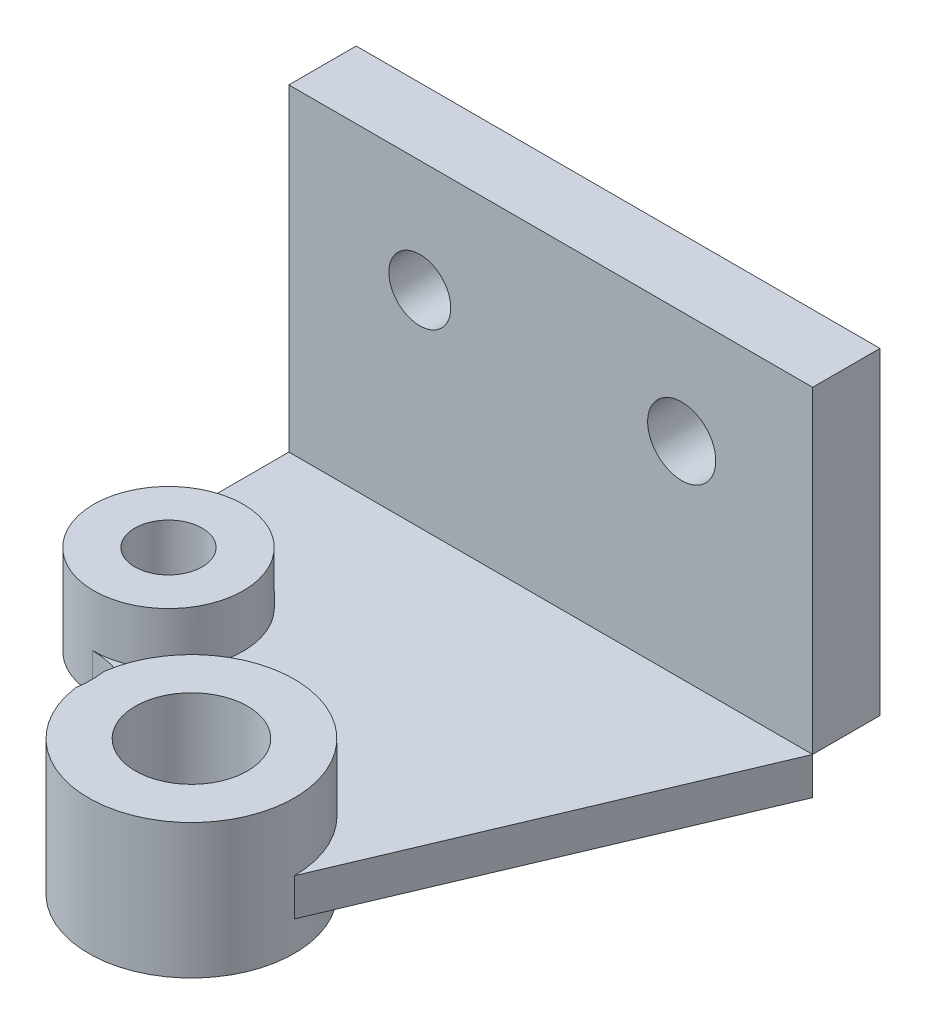
ISO-10303-21;
HEADER;
FILE_DESCRIPTION(('STEP AP214'),'2;1');
FILE_NAME('part.step','',(''),(''),'','','');
FILE_SCHEMA(('AUTOMOTIVE_DESIGN { 1 0 10303 214 1 1 1 1 }'));
ENDSEC;
DATA;
#1=APPLICATION_CONTEXT('core data for automotive mechanical design processes');
#2=APPLICATION_PROTOCOL_DEFINITION('international standard','automotive_design',2000,#1);
#3=PRODUCT_CONTEXT('',#1,'mechanical');
#4=PRODUCT('Part','Part','',(#3));
#5=PRODUCT_RELATED_PRODUCT_CATEGORY('part','',(#4));
#6=PRODUCT_DEFINITION_FORMATION('','',#4);
#7=PRODUCT_DEFINITION_CONTEXT('part definition',#1,'design');
#8=PRODUCT_DEFINITION('design','',#6,#7);
#9=PRODUCT_DEFINITION_SHAPE('','',#8);
#10=(LENGTH_UNIT() NAMED_UNIT(*) SI_UNIT(.MILLI.,.METRE.));
#11=(NAMED_UNIT(*) PLANE_ANGLE_UNIT() SI_UNIT($,.RADIAN.));
#12=(NAMED_UNIT(*) SI_UNIT($,.STERADIAN.) SOLID_ANGLE_UNIT());
#13=UNCERTAINTY_MEASURE_WITH_UNIT(LENGTH_MEASURE(1.E-05),#10,'distance_accuracy_value','');
#14=(GEOMETRIC_REPRESENTATION_CONTEXT(3) GLOBAL_UNCERTAINTY_ASSIGNED_CONTEXT((#13)) GLOBAL_UNIT_ASSIGNED_CONTEXT((#10,
#11,#12)) REPRESENTATION_CONTEXT('',''));
#15=CARTESIAN_POINT('',(0.,0.,0.));
#16=DIRECTION('',(0.,0.,1.));
#17=DIRECTION('',(1.,0.,0.));
#18=AXIS2_PLACEMENT_3D('',#15,#16,#17);
#19=CARTESIAN_POINT('',(0.,-10.,0.));
#20=DIRECTION('',(0.,-1.,0.));
#21=DIRECTION('',(0.,0.,-1.));
#22=AXIS2_PLACEMENT_3D('',#19,#20,#21);
#23=PLANE('',#22);
#24=CARTESIAN_POINT('',(20.,-10.,70.1791519576929));
#25=DIRECTION('',(0.,-1.,0.));
#26=DIRECTION('',(0.,0.,-1.));
#27=AXIS2_PLACEMENT_3D('',#24,#25,#26);
#28=CIRCLE('',#27,9.00000000000001);
#29=CARTESIAN_POINT('',(20.,-10.,61.1791519576929));
#30=VERTEX_POINT('',#29);
#31=EDGE_CURVE('E124',#30,#30,#28,.T.);
#32=ORIENTED_EDGE('',*,*,#31,.F.);
#33=EDGE_LOOP('',(#32));
#34=FACE_BOUND('',#33,.T.);
#35=DIRECTION('',(0.389811327133465,0.,-0.920894743843425));
#36=VECTOR('',#35,1.);
#37=CARTESIAN_POINT('',(125.188151733844,-10.,52.9916799884053));
#38=LINE('',#37,#36);
#39=CARTESIAN_POINT('',(98.7976819255714,-10.,115.336828121249));
#40=VERTEX_POINT('',#39);
#41=CARTESIAN_POINT('',(140.,-10.,18.));
#42=VERTEX_POINT('',#41);
#43=EDGE_CURVE('E140',#40,#42,#38,.T.);
#44=ORIENTED_EDGE('',*,*,#43,.F.);
#45=CARTESIAN_POINT('',(71.2976819255714,-10.,115.336828121249));
#46=DIRECTION('',(0.,-1.,0.));
#47=DIRECTION('',(0.,0.,-1.));
#48=AXIS2_PLACEMENT_3D('',#45,#46,#47);
#49=CIRCLE('',#48,27.5);
#50=CARTESIAN_POINT('',(44.0744459930219,-10.,111.445115726847));
#51=VERTEX_POINT('',#50);
#52=EDGE_CURVE('E133',#40,#51,#49,.F.);
#53=ORIENTED_EDGE('',*,*,#52,.T.);
#54=CARTESIAN_POINT('',(19.3541797575653,-10.,115.174517454758));
#55=DIRECTION('',(0.,-1.,0.));
#56=DIRECTION('',(0.,0.,-1.));
#57=AXIS2_PLACEMENT_3D('',#54,#55,#56);
#58=CIRCLE('',#57,25.);
#59=CARTESIAN_POINT('',(19.7129687811401,-10.,90.1770921786106));
#60=VERTEX_POINT('',#59);
#61=EDGE_CURVE('E104',#51,#60,#58,.F.);
#62=ORIENTED_EDGE('',*,*,#61,.T.);
#63=CARTESIAN_POINT('',(20.,-10.,70.1791519576929));
#64=DIRECTION('',(0.,-1.,0.));
#65=DIRECTION('',(0.,0.,-1.));
#66=AXIS2_PLACEMENT_3D('',#63,#64,#65);
#67=CIRCLE('',#66,20.);
#68=CARTESIAN_POINT('',(0.,-10.,70.1791519576929));
#69=VERTEX_POINT('',#68);
#70=EDGE_CURVE('E96',#60,#69,#67,.T.);
#71=ORIENTED_EDGE('',*,*,#70,.T.);
#72=DIRECTION('',(0.,0.,-1.));
#73=VECTOR('',#72,1.);
#74=CARTESIAN_POINT('',(0.,-10.,0.));
#75=LINE('',#74,#73);
#76=CARTESIAN_POINT('',(0.,-10.,18.));
#77=VERTEX_POINT('',#76);
#78=EDGE_CURVE('E100',#69,#77,#75,.T.);
#79=ORIENTED_EDGE('',*,*,#78,.T.);
#80=DIRECTION('',(-1.,0.,0.));
#81=VECTOR('',#80,1.);
#82=CARTESIAN_POINT('',(0.,-10.,18.));
#83=LINE('',#82,#81);
#84=EDGE_CURVE('E122',#42,#77,#83,.T.);
#85=ORIENTED_EDGE('',*,*,#84,.F.);
#86=EDGE_LOOP('',(#44,#53,#62,#71,#79,#85));
#87=FACE_BOUND('',#86,.T.);
#88=ADVANCED_FACE('F43',(#34,#87),#23,.T.);
#89=CARTESIAN_POINT('',(0.,0.,0.));
#90=DIRECTION('',(0.,-1.,0.));
#91=DIRECTION('',(0.,0.,-1.));
#92=AXIS2_PLACEMENT_3D('',#89,#90,#91);
#93=PLANE('',#92);
#94=DIRECTION('',(0.,0.,-1.));
#95=VECTOR('',#94,1.);
#96=CARTESIAN_POINT('',(0.,0.,0.));
#97=LINE('',#96,#95);
#98=CARTESIAN_POINT('',(0.,0.,70.1791519576929));
#99=VERTEX_POINT('',#98);
#100=CARTESIAN_POINT('',(0.,0.,18.));
#101=VERTEX_POINT('',#100);
#102=EDGE_CURVE('E135',#99,#101,#97,.T.);
#103=ORIENTED_EDGE('',*,*,#102,.F.);
#104=CARTESIAN_POINT('',(20.,0.,70.1791519576929));
#105=DIRECTION('',(0.,-1.,0.));
#106=DIRECTION('',(0.,0.,-1.));
#107=AXIS2_PLACEMENT_3D('',#104,#105,#106);
#108=CIRCLE('',#107,20.);
#109=CARTESIAN_POINT('',(19.7129687811401,0.,90.1770921786106));
#110=VERTEX_POINT('',#109);
#111=EDGE_CURVE('E114',#99,#110,#108,.T.);
#112=ORIENTED_EDGE('',*,*,#111,.T.);
#113=CARTESIAN_POINT('',(19.3541797575653,0.,115.174517454758));
#114=DIRECTION('',(0.,-1.,0.));
#115=DIRECTION('',(0.,0.,-1.));
#116=AXIS2_PLACEMENT_3D('',#113,#114,#115);
#117=CIRCLE('',#116,25.);
#118=CARTESIAN_POINT('',(44.0744459930219,0.,111.445115726847));
#119=VERTEX_POINT('',#118);
#120=EDGE_CURVE('E132',#119,#110,#117,.F.);
#121=ORIENTED_EDGE('',*,*,#120,.F.);
#122=CARTESIAN_POINT('',(71.2976819255714,0.,115.336828121249));
#123=DIRECTION('',(0.,-1.,0.));
#124=DIRECTION('',(0.,0.,-1.));
#125=AXIS2_PLACEMENT_3D('',#122,#123,#124);
#126=CIRCLE('',#125,27.5);
#127=CARTESIAN_POINT('',(98.7976819255714,0.,115.336828121249));
#128=VERTEX_POINT('',#127);
#129=EDGE_CURVE('E12',#128,#119,#126,.F.);
#130=ORIENTED_EDGE('',*,*,#129,.F.);
#131=DIRECTION('',(0.389811327133465,0.,-0.920894743843425));
#132=VECTOR('',#131,1.);
#133=CARTESIAN_POINT('',(125.188151733844,0.,52.9916799884053));
#134=LINE('',#133,#132);
#135=CARTESIAN_POINT('',(140.,0.,18.));
#136=VERTEX_POINT('',#135);
#137=EDGE_CURVE('E130',#128,#136,#134,.T.);
#138=ORIENTED_EDGE('',*,*,#137,.T.);
#139=DIRECTION('',(-1.,0.,0.));
#140=VECTOR('',#139,1.);
#141=CARTESIAN_POINT('',(0.,0.,18.));
#142=LINE('',#141,#140);
#143=EDGE_CURVE('E137',#136,#101,#142,.T.);
#144=ORIENTED_EDGE('',*,*,#143,.T.);
#145=EDGE_LOOP('',(#103,#112,#121,#130,#138,#144));
#146=FACE_BOUND('',#145,.T.);
#147=ADVANCED_FACE('F154',(#146),#93,.F.);
#148=CARTESIAN_POINT('',(125.188151733844,-10.,52.9916799884053));
#149=DIRECTION('',(0.920894743843425,0.,0.389811327133465));
#150=DIRECTION('',(0.389811327133465,0.,-0.920894743843425));
#151=AXIS2_PLACEMENT_3D('',#148,#149,#150);
#152=PLANE('',#151);
#153=ORIENTED_EDGE('',*,*,#137,.F.);
#154=DIRECTION('',(0.,1.,0.));
#155=VECTOR('',#154,1.);
#156=CARTESIAN_POINT('',(98.7976819255714,-10.,115.336828121249));
#157=LINE('',#156,#155);
#158=EDGE_CURVE('E51',#40,#128,#157,.T.);
#159=ORIENTED_EDGE('',*,*,#158,.F.);
#160=ORIENTED_EDGE('',*,*,#43,.T.);
#161=DIRECTION('',(0.,1.,0.));
#162=VECTOR('',#161,1.);
#163=CARTESIAN_POINT('',(140.,-10.,18.));
#164=LINE('',#163,#162);
#165=EDGE_CURVE('E66',#42,#136,#164,.T.);
#166=ORIENTED_EDGE('',*,*,#165,.T.);
#167=EDGE_LOOP('',(#153,#159,#160,#166));
#168=FACE_BOUND('',#167,.T.);
#169=ADVANCED_FACE('F45',(#168),#152,.T.);
#170=CARTESIAN_POINT('',(71.2976819255714,-10.,115.336828121249));
#171=DIRECTION('',(0.,1.,0.));
#172=DIRECTION('',(0.,0.,1.));
#173=AXIS2_PLACEMENT_3D('',#170,#171,#172);
#174=CYLINDRICAL_SURFACE('',#173,27.5);
#175=ORIENTED_EDGE('',*,*,#158,.T.);
#176=ORIENTED_EDGE('',*,*,#129,.T.);
#177=DIRECTION('',(0.,1.,0.));
#178=VECTOR('',#177,1.);
#179=CARTESIAN_POINT('',(44.0744459930219,-18.,111.445115726847));
#180=LINE('',#179,#178);
#181=CARTESIAN_POINT('',(44.0744459930219,18.,111.445115726847));
#182=VERTEX_POINT('',#181);
#183=EDGE_CURVE('E58',#119,#182,#180,.T.);
#184=ORIENTED_EDGE('',*,*,#183,.T.);
#185=CARTESIAN_POINT('',(71.2976819255714,18.,115.336828121249));
#186=DIRECTION('',(0.,-1.,0.));
#187=DIRECTION('',(0.,0.,-1.));
#188=AXIS2_PLACEMENT_3D('',#185,#186,#187);
#189=CIRCLE('',#188,27.5);
#190=CARTESIAN_POINT('',(44.0506565576346,18.,119.058334348439));
#191=VERTEX_POINT('',#190);
#192=EDGE_CURVE('E178',#182,#191,#189,.T.);
#193=ORIENTED_EDGE('',*,*,#192,.T.);
#194=DIRECTION('',(0.,1.,0.));
#195=VECTOR('',#194,1.);
#196=CARTESIAN_POINT('',(44.0506565576346,-10.,119.058334348439));
#197=LINE('',#196,#195);
#198=CARTESIAN_POINT('',(44.0506565576346,-18.,119.058334348439));
#199=VERTEX_POINT('',#198);
#200=EDGE_CURVE('E144',#199,#191,#197,.T.);
#201=ORIENTED_EDGE('',*,*,#200,.F.);
#202=CARTESIAN_POINT('',(71.2976819255714,-18.,115.336828121249));
#203=DIRECTION('',(0.,-1.,0.));
#204=DIRECTION('',(0.,0.,-1.));
#205=AXIS2_PLACEMENT_3D('',#202,#203,#204);
#206=CIRCLE('',#205,27.5);
#207=CARTESIAN_POINT('',(44.0744459930219,-18.,111.445115726847));
#208=VERTEX_POINT('',#207);
#209=EDGE_CURVE('E170',#208,#199,#206,.T.);
#210=ORIENTED_EDGE('',*,*,#209,.F.);
#211=EDGE_CURVE('E165',#208,#51,#180,.T.);
#212=ORIENTED_EDGE('',*,*,#211,.T.);
#213=ORIENTED_EDGE('',*,*,#52,.F.);
#214=EDGE_LOOP('',(#175,#176,#184,#193,#201,#210,#212,#213));
#215=FACE_BOUND('',#214,.T.);
#216=ADVANCED_FACE('F148',(#215),#174,.T.);
#217=CARTESIAN_POINT('',(19.3541797575653,-10.,115.174517454758));
#218=DIRECTION('',(0.,1.,0.));
#219=DIRECTION('',(0.,0.,1.));
#220=AXIS2_PLACEMENT_3D('',#217,#218,#219);
#221=CYLINDRICAL_SURFACE('',#220,25.);
#222=ORIENTED_EDGE('',*,*,#200,.T.);
#223=CARTESIAN_POINT('',(19.3541797575653,18.,115.174517454758));
#224=DIRECTION('',(0.,-1.,0.));
#225=DIRECTION('',(0.,0.,-1.));
#226=AXIS2_PLACEMENT_3D('',#223,#224,#225);
#227=CIRCLE('',#226,25.);
#228=EDGE_CURVE('E174',#191,#182,#227,.F.);
#229=ORIENTED_EDGE('',*,*,#228,.T.);
#230=ORIENTED_EDGE('',*,*,#183,.F.);
#231=ORIENTED_EDGE('',*,*,#120,.T.);
#232=DIRECTION('',(0.,1.,0.));
#233=VECTOR('',#232,1.);
#234=CARTESIAN_POINT('',(19.7129687811401,-10.,90.1770921786106));
#235=LINE('',#234,#233);
#236=EDGE_CURVE('E118',#60,#110,#235,.T.);
#237=ORIENTED_EDGE('',*,*,#236,.F.);
#238=ORIENTED_EDGE('',*,*,#61,.F.);
#239=ORIENTED_EDGE('',*,*,#211,.F.);
#240=CARTESIAN_POINT('',(19.3541797575653,-18.,115.174517454758));
#241=DIRECTION('',(0.,-1.,0.));
#242=DIRECTION('',(0.,0.,-1.));
#243=AXIS2_PLACEMENT_3D('',#240,#241,#242);
#244=CIRCLE('',#243,25.);
#245=EDGE_CURVE('E172',#199,#208,#244,.F.);
#246=ORIENTED_EDGE('',*,*,#245,.F.);
#247=EDGE_LOOP('',(#222,#229,#230,#231,#237,#238,#239,#246));
#248=FACE_BOUND('',#247,.T.);
#249=ADVANCED_FACE('F161',(#248),#221,.F.);
#250=CARTESIAN_POINT('',(20.,-10.,70.1791519576929));
#251=DIRECTION('',(0.,1.,0.));
#252=DIRECTION('',(0.,0.,1.));
#253=AXIS2_PLACEMENT_3D('',#250,#251,#252);
#254=CYLINDRICAL_SURFACE('',#253,20.);
#255=ORIENTED_EDGE('',*,*,#236,.T.);
#256=ORIENTED_EDGE('',*,*,#111,.F.);
#257=DIRECTION('',(0.,1.,0.));
#258=VECTOR('',#257,1.);
#259=CARTESIAN_POINT('',(0.,-10.,70.1791519576929));
#260=LINE('',#259,#258);
#261=EDGE_CURVE('E110',#69,#99,#260,.T.);
#262=ORIENTED_EDGE('',*,*,#261,.F.);
#263=ORIENTED_EDGE('',*,*,#70,.F.);
#264=EDGE_LOOP('',(#255,#256,#262,#263));
#265=FACE_BOUND('',#264,.T.);
#266=CARTESIAN_POINT('',(20.,14.,70.1791519576929));
#267=DIRECTION('',(0.,-1.,0.));
#268=DIRECTION('',(0.,0.,-1.));
#269=AXIS2_PLACEMENT_3D('',#266,#267,#268);
#270=CIRCLE('',#269,20.);
#271=CARTESIAN_POINT('',(20.,14.,50.1791519576929));
#272=VERTEX_POINT('',#271);
#273=EDGE_CURVE('E184',#272,#272,#270,.T.);
#274=ORIENTED_EDGE('',*,*,#273,.T.);
#275=EDGE_LOOP('',(#274));
#276=FACE_BOUND('',#275,.T.);
#277=ADVANCED_FACE('F111',(#265,#276),#254,.T.);
#278=CARTESIAN_POINT('',(0.,-10.,0.));
#279=DIRECTION('',(1.,0.,0.));
#280=DIRECTION('',(0.,0.,-1.));
#281=AXIS2_PLACEMENT_3D('',#278,#279,#280);
#282=PLANE('',#281);
#283=ORIENTED_EDGE('',*,*,#102,.T.);
#284=DIRECTION('',(0.,1.,0.));
#285=VECTOR('',#284,1.);
#286=CARTESIAN_POINT('',(0.,-10.,18.));
#287=LINE('',#286,#285);
#288=EDGE_CURVE('E119',#77,#101,#287,.T.);
#289=ORIENTED_EDGE('',*,*,#288,.F.);
#290=ORIENTED_EDGE('',*,*,#78,.F.);
#291=ORIENTED_EDGE('',*,*,#261,.T.);
#292=EDGE_LOOP('',(#283,#289,#290,#291));
#293=FACE_BOUND('',#292,.T.);
#294=ADVANCED_FACE('F121',(#293),#282,.F.);
#295=CARTESIAN_POINT('',(20.,-10.,70.1791519576929));
#296=DIRECTION('',(0.,1.,0.));
#297=DIRECTION('',(0.,0.,1.));
#298=AXIS2_PLACEMENT_3D('',#295,#296,#297);
#299=CYLINDRICAL_SURFACE('',#298,9.00000000000001);
#300=ORIENTED_EDGE('',*,*,#31,.T.);
#301=EDGE_LOOP('',(#300));
#302=FACE_BOUND('',#301,.T.);
#303=CARTESIAN_POINT('',(20.,14.,70.1791519576929));
#304=DIRECTION('',(0.,-1.,0.));
#305=DIRECTION('',(0.,0.,-1.));
#306=AXIS2_PLACEMENT_3D('',#303,#304,#305);
#307=CIRCLE('',#306,9.00000000000001);
#308=CARTESIAN_POINT('',(20.,14.,61.1791519576929));
#309=VERTEX_POINT('',#308);
#310=EDGE_CURVE('E159',#309,#309,#307,.T.);
#311=ORIENTED_EDGE('',*,*,#310,.F.);
#312=EDGE_LOOP('',(#311));
#313=FACE_BOUND('',#312,.T.);
#314=ADVANCED_FACE('F198',(#302,#313),#299,.F.);
#315=CARTESIAN_POINT('',(0.,-10.,18.));
#316=DIRECTION('',(0.,0.,-1.));
#317=DIRECTION('',(-1.,0.,0.));
#318=AXIS2_PLACEMENT_3D('',#315,#316,#317);
#319=PLANE('',#318);
#320=ORIENTED_EDGE('',*,*,#143,.F.);
#321=ORIENTED_EDGE('',*,*,#165,.F.);
#322=ORIENTED_EDGE('',*,*,#84,.T.);
#323=ORIENTED_EDGE('',*,*,#288,.T.);
#324=EDGE_LOOP('',(#320,#321,#322,#323));
#325=FACE_BOUND('',#324,.T.);
#326=ADVANCED_FACE('F155',(#325),#319,.T.);
#327=CARTESIAN_POINT('',(0.,18.,0.));
#328=DIRECTION('',(0.,-1.,0.));
#329=DIRECTION('',(0.,0.,-1.));
#330=AXIS2_PLACEMENT_3D('',#327,#328,#329);
#331=PLANE('',#330);
#332=CARTESIAN_POINT('',(71.2976819255714,18.,115.336828121249));
#333=DIRECTION('',(0.,-1.,0.));
#334=DIRECTION('',(0.,0.,-1.));
#335=AXIS2_PLACEMENT_3D('',#332,#333,#334);
#336=CIRCLE('',#335,15.);
#337=CARTESIAN_POINT('',(71.2976819255714,18.,100.336828121249));
#338=VERTEX_POINT('',#337);
#339=EDGE_CURVE('E181',#338,#338,#336,.T.);
#340=ORIENTED_EDGE('',*,*,#339,.T.);
#341=EDGE_LOOP('',(#340));
#342=FACE_BOUND('',#341,.T.);
#343=ORIENTED_EDGE('',*,*,#192,.F.);
#344=ORIENTED_EDGE('',*,*,#228,.F.);
#345=EDGE_LOOP('',(#343,#344));
#346=FACE_BOUND('',#345,.T.);
#347=ADVANCED_FACE('F206',(#342,#346),#331,.F.);
#348=CARTESIAN_POINT('',(71.2976819255714,-10.,115.336828121249));
#349=DIRECTION('',(0.,1.,0.));
#350=DIRECTION('',(0.,0.,1.));
#351=AXIS2_PLACEMENT_3D('',#348,#349,#350);
#352=CYLINDRICAL_SURFACE('',#351,15.);
#353=ORIENTED_EDGE('',*,*,#339,.F.);
#354=EDGE_LOOP('',(#353));
#355=FACE_BOUND('',#354,.T.);
#356=CARTESIAN_POINT('',(71.2976819255714,-18.,115.336828121249));
#357=DIRECTION('',(0.,-1.,0.));
#358=DIRECTION('',(0.,0.,-1.));
#359=AXIS2_PLACEMENT_3D('',#356,#357,#358);
#360=CIRCLE('',#359,15.);
#361=CARTESIAN_POINT('',(71.2976819255714,-18.,100.336828121249));
#362=VERTEX_POINT('',#361);
#363=EDGE_CURVE('E177',#362,#362,#360,.T.);
#364=ORIENTED_EDGE('',*,*,#363,.T.);
#365=EDGE_LOOP('',(#364));
#366=FACE_BOUND('',#365,.T.);
#367=ADVANCED_FACE('F220',(#355,#366),#352,.F.);
#368=CARTESIAN_POINT('',(0.,-18.,0.));
#369=DIRECTION('',(0.,-1.,0.));
#370=DIRECTION('',(0.,0.,-1.));
#371=AXIS2_PLACEMENT_3D('',#368,#369,#370);
#372=PLANE('',#371);
#373=ORIENTED_EDGE('',*,*,#363,.F.);
#374=EDGE_LOOP('',(#373));
#375=FACE_BOUND('',#374,.T.);
#376=ORIENTED_EDGE('',*,*,#209,.T.);
#377=ORIENTED_EDGE('',*,*,#245,.T.);
#378=EDGE_LOOP('',(#376,#377));
#379=FACE_BOUND('',#378,.T.);
#380=ADVANCED_FACE('F222',(#375,#379),#372,.T.);
#381=CARTESIAN_POINT('',(0.,14.,0.));
#382=DIRECTION('',(0.,-1.,0.));
#383=DIRECTION('',(0.,0.,-1.));
#384=AXIS2_PLACEMENT_3D('',#381,#382,#383);
#385=PLANE('',#384);
#386=ORIENTED_EDGE('',*,*,#310,.T.);
#387=EDGE_LOOP('',(#386));
#388=FACE_BOUND('',#387,.T.);
#389=ORIENTED_EDGE('',*,*,#273,.F.);
#390=EDGE_LOOP('',(#389));
#391=FACE_BOUND('',#390,.T.);
#392=ADVANCED_FACE('F195',(#388,#391),#385,.F.);
#393=CLOSED_SHELL('',(#88,#147,#169,#216,#249,#277,#294,#314,#326,#347,#367,#380,#392));
#394=MANIFOLD_SOLID_BREP('B2',#393);
#395=CARTESIAN_POINT('',(0.,0.,18.));
#396=DIRECTION('',(1.,0.,0.));
#397=DIRECTION('',(0.,0.,-1.));
#398=AXIS2_PLACEMENT_3D('',#395,#396,#397);
#399=PLANE('',#398);
#400=DIRECTION('',(0.,-1.,0.));
#401=VECTOR('',#400,1.);
#402=CARTESIAN_POINT('',(0.,0.,0.));
#403=LINE('',#402,#401);
#404=CARTESIAN_POINT('',(0.,85.,0.));
#405=VERTEX_POINT('',#404);
#406=CARTESIAN_POINT('',(0.,0.,0.));
#407=VERTEX_POINT('',#406);
#408=EDGE_CURVE('E417',#405,#407,#403,.T.);
#409=ORIENTED_EDGE('',*,*,#408,.T.);
#410=DIRECTION('',(0.,0.,-1.));
#411=VECTOR('',#410,1.);
#412=CARTESIAN_POINT('',(0.,0.,18.));
#413=LINE('',#412,#411);
#414=CARTESIAN_POINT('',(0.,0.,18.));
#415=VERTEX_POINT('',#414);
#416=EDGE_CURVE('E41',#415,#407,#413,.T.);
#417=ORIENTED_EDGE('',*,*,#416,.F.);
#418=DIRECTION('',(0.,-1.,0.));
#419=VECTOR('',#418,1.);
#420=CARTESIAN_POINT('',(0.,0.,18.));
#421=LINE('',#420,#419);
#422=CARTESIAN_POINT('',(0.,85.,18.));
#423=VERTEX_POINT('',#422);
#424=EDGE_CURVE('E405',#423,#415,#421,.T.);
#425=ORIENTED_EDGE('',*,*,#424,.F.);
#426=DIRECTION('',(0.,0.,-1.));
#427=VECTOR('',#426,1.);
#428=CARTESIAN_POINT('',(0.,85.,18.));
#429=LINE('',#428,#427);
#430=EDGE_CURVE('E413',#423,#405,#429,.T.);
#431=ORIENTED_EDGE('',*,*,#430,.T.);
#432=EDGE_LOOP('',(#409,#417,#425,#431));
#433=FACE_BOUND('',#432,.T.);
#434=ADVANCED_FACE('F354',(#433),#399,.F.);
#435=CARTESIAN_POINT('',(0.,0.,18.));
#436=DIRECTION('',(0.,1.,0.));
#437=DIRECTION('',(0.,0.,1.));
#438=AXIS2_PLACEMENT_3D('',#435,#436,#437);
#439=PLANE('',#438);
#440=DIRECTION('',(1.,0.,0.));
#441=VECTOR('',#440,1.);
#442=CARTESIAN_POINT('',(0.,0.,0.));
#443=LINE('',#442,#441);
#444=CARTESIAN_POINT('',(140.,0.,0.));
#445=VERTEX_POINT('',#444);
#446=EDGE_CURVE('E409',#407,#445,#443,.T.);
#447=ORIENTED_EDGE('',*,*,#446,.T.);
#448=DIRECTION('',(0.,0.,-1.));
#449=VECTOR('',#448,1.);
#450=CARTESIAN_POINT('',(140.,0.,18.));
#451=LINE('',#450,#449);
#452=CARTESIAN_POINT('',(140.,0.,18.));
#453=VERTEX_POINT('',#452);
#454=EDGE_CURVE('E362',#453,#445,#451,.T.);
#455=ORIENTED_EDGE('',*,*,#454,.F.);
#456=DIRECTION('',(1.,0.,0.));
#457=VECTOR('',#456,1.);
#458=CARTESIAN_POINT('',(0.,0.,18.));
#459=LINE('',#458,#457);
#460=EDGE_CURVE('E400',#415,#453,#459,.T.);
#461=ORIENTED_EDGE('',*,*,#460,.F.);
#462=ORIENTED_EDGE('',*,*,#416,.T.);
#463=EDGE_LOOP('',(#447,#455,#461,#462));
#464=FACE_BOUND('',#463,.T.);
#465=ADVANCED_FACE('F408',(#464),#439,.F.);
#466=CARTESIAN_POINT('',(140.,0.,18.));
#467=DIRECTION('',(-1.,0.,0.));
#468=DIRECTION('',(0.,0.,1.));
#469=AXIS2_PLACEMENT_3D('',#466,#467,#468);
#470=PLANE('',#469);
#471=DIRECTION('',(0.,1.,0.));
#472=VECTOR('',#471,1.);
#473=CARTESIAN_POINT('',(140.,0.,0.));
#474=LINE('',#473,#472);
#475=CARTESIAN_POINT('',(140.,85.,0.));
#476=VERTEX_POINT('',#475);
#477=EDGE_CURVE('E387',#445,#476,#474,.T.);
#478=ORIENTED_EDGE('',*,*,#477,.T.);
#479=DIRECTION('',(0.,0.,-1.));
#480=VECTOR('',#479,1.);
#481=CARTESIAN_POINT('',(140.,85.,18.));
#482=LINE('',#481,#480);
#483=CARTESIAN_POINT('',(140.,85.,18.));
#484=VERTEX_POINT('',#483);
#485=EDGE_CURVE('E410',#484,#476,#482,.T.);
#486=ORIENTED_EDGE('',*,*,#485,.F.);
#487=DIRECTION('',(0.,1.,0.));
#488=VECTOR('',#487,1.);
#489=CARTESIAN_POINT('',(140.,0.,18.));
#490=LINE('',#489,#488);
#491=EDGE_CURVE('E403',#453,#484,#490,.T.);
#492=ORIENTED_EDGE('',*,*,#491,.F.);
#493=ORIENTED_EDGE('',*,*,#454,.T.);
#494=EDGE_LOOP('',(#478,#486,#492,#493));
#495=FACE_BOUND('',#494,.T.);
#496=ADVANCED_FACE('F411',(#495),#470,.F.);
#497=CARTESIAN_POINT('',(0.,85.,18.));
#498=DIRECTION('',(0.,-1.,0.));
#499=DIRECTION('',(0.,0.,-1.));
#500=AXIS2_PLACEMENT_3D('',#497,#498,#499);
#501=PLANE('',#500);
#502=DIRECTION('',(-1.,0.,0.));
#503=VECTOR('',#502,1.);
#504=CARTESIAN_POINT('',(0.,85.,0.));
#505=LINE('',#504,#503);
#506=EDGE_CURVE('E393',#476,#405,#505,.T.);
#507=ORIENTED_EDGE('',*,*,#506,.T.);
#508=ORIENTED_EDGE('',*,*,#430,.F.);
#509=DIRECTION('',(-1.,0.,0.));
#510=VECTOR('',#509,1.);
#511=CARTESIAN_POINT('',(0.,85.,18.));
#512=LINE('',#511,#510);
#513=EDGE_CURVE('E370',#484,#423,#512,.T.);
#514=ORIENTED_EDGE('',*,*,#513,.F.);
#515=ORIENTED_EDGE('',*,*,#485,.T.);
#516=EDGE_LOOP('',(#507,#508,#514,#515));
#517=FACE_BOUND('',#516,.T.);
#518=ADVANCED_FACE('F425',(#517),#501,.F.);
#519=CARTESIAN_POINT('',(0.,0.,18.));
#520=DIRECTION('',(0.,0.,-1.));
#521=DIRECTION('',(-1.,0.,0.));
#522=AXIS2_PLACEMENT_3D('',#519,#520,#521);
#523=PLANE('',#522);
#524=CARTESIAN_POINT('',(35.,55.,18.));
#525=DIRECTION('',(0.,0.,1.));
#526=DIRECTION('',(1.,0.,0.));
#527=AXIS2_PLACEMENT_3D('',#524,#525,#526);
#528=CIRCLE('',#527,8.27070354557295);
#529=CARTESIAN_POINT('',(43.2707035455729,55.,18.));
#530=VERTEX_POINT('',#529);
#531=EDGE_CURVE('E437',#530,#530,#528,.T.);
#532=ORIENTED_EDGE('',*,*,#531,.F.);
#533=EDGE_LOOP('',(#532));
#534=FACE_BOUND('',#533,.T.);
#535=CARTESIAN_POINT('',(105.,55.,18.));
#536=DIRECTION('',(0.,0.,1.));
#537=DIRECTION('',(1.,0.,0.));
#538=AXIS2_PLACEMENT_3D('',#535,#536,#537);
#539=CIRCLE('',#538,9.09885958573335);
#540=CARTESIAN_POINT('',(114.098859585733,55.,18.));
#541=VERTEX_POINT('',#540);
#542=EDGE_CURVE('E434',#541,#541,#539,.T.);
#543=ORIENTED_EDGE('',*,*,#542,.F.);
#544=EDGE_LOOP('',(#543));
#545=FACE_BOUND('',#544,.T.);
#546=ORIENTED_EDGE('',*,*,#424,.T.);
#547=ORIENTED_EDGE('',*,*,#460,.T.);
#548=ORIENTED_EDGE('',*,*,#491,.T.);
#549=ORIENTED_EDGE('',*,*,#513,.T.);
#550=EDGE_LOOP('',(#546,#547,#548,#549));
#551=FACE_BOUND('',#550,.T.);
#552=ADVANCED_FACE('F401',(#534,#545,#551),#523,.F.);
#553=CARTESIAN_POINT('',(0.,0.,0.));
#554=DIRECTION('',(0.,0.,-1.));
#555=DIRECTION('',(-1.,0.,0.));
#556=AXIS2_PLACEMENT_3D('',#553,#554,#555);
#557=PLANE('',#556);
#558=CARTESIAN_POINT('',(35.,55.,0.));
#559=DIRECTION('',(0.,0.,1.));
#560=DIRECTION('',(1.,0.,0.));
#561=AXIS2_PLACEMENT_3D('',#558,#559,#560);
#562=CIRCLE('',#561,8.27070354557295);
#563=CARTESIAN_POINT('',(43.2707035455729,55.,0.));
#564=VERTEX_POINT('',#563);
#565=EDGE_CURVE('E420',#564,#564,#562,.T.);
#566=ORIENTED_EDGE('',*,*,#565,.T.);
#567=EDGE_LOOP('',(#566));
#568=FACE_BOUND('',#567,.T.);
#569=CARTESIAN_POINT('',(105.,55.,0.));
#570=DIRECTION('',(0.,0.,1.));
#571=DIRECTION('',(1.,0.,0.));
#572=AXIS2_PLACEMENT_3D('',#569,#570,#571);
#573=CIRCLE('',#572,9.09885958573335);
#574=CARTESIAN_POINT('',(114.098859585733,55.,0.));
#575=VERTEX_POINT('',#574);
#576=EDGE_CURVE('E431',#575,#575,#573,.T.);
#577=ORIENTED_EDGE('',*,*,#576,.T.);
#578=EDGE_LOOP('',(#577));
#579=FACE_BOUND('',#578,.T.);
#580=ORIENTED_EDGE('',*,*,#408,.F.);
#581=ORIENTED_EDGE('',*,*,#506,.F.);
#582=ORIENTED_EDGE('',*,*,#477,.F.);
#583=ORIENTED_EDGE('',*,*,#446,.F.);
#584=EDGE_LOOP('',(#580,#581,#582,#583));
#585=FACE_BOUND('',#584,.T.);
#586=ADVANCED_FACE('F428',(#568,#579,#585),#557,.T.);
#587=CARTESIAN_POINT('',(105.,55.,0.));
#588=DIRECTION('',(0.,0.,1.));
#589=DIRECTION('',(1.,0.,0.));
#590=AXIS2_PLACEMENT_3D('',#587,#588,#589);
#591=CYLINDRICAL_SURFACE('',#590,9.09885958573335);
#592=ORIENTED_EDGE('',*,*,#576,.F.);
#593=EDGE_LOOP('',(#592));
#594=FACE_BOUND('',#593,.T.);
#595=ORIENTED_EDGE('',*,*,#542,.T.);
#596=EDGE_LOOP('',(#595));
#597=FACE_BOUND('',#596,.T.);
#598=ADVANCED_FACE('F448',(#594,#597),#591,.F.);
#599=CARTESIAN_POINT('',(35.,55.,0.));
#600=DIRECTION('',(0.,0.,1.));
#601=DIRECTION('',(1.,0.,0.));
#602=AXIS2_PLACEMENT_3D('',#599,#600,#601);
#603=CYLINDRICAL_SURFACE('',#602,8.27070354557295);
#604=ORIENTED_EDGE('',*,*,#565,.F.);
#605=EDGE_LOOP('',(#604));
#606=FACE_BOUND('',#605,.T.);
#607=ORIENTED_EDGE('',*,*,#531,.T.);
#608=EDGE_LOOP('',(#607));
#609=FACE_BOUND('',#608,.T.);
#610=ADVANCED_FACE('F445',(#606,#609),#603,.F.);
#611=CLOSED_SHELL('',(#434,#465,#496,#518,#552,#586,#598,#610));
#612=MANIFOLD_SOLID_BREP('B6',#611);
#613=ADVANCED_BREP_SHAPE_REPRESENTATION('',(#18,#394,#612),#14);
#614=SHAPE_DEFINITION_REPRESENTATION(#9,#613);
ENDSEC;
END-ISO-10303-21;
